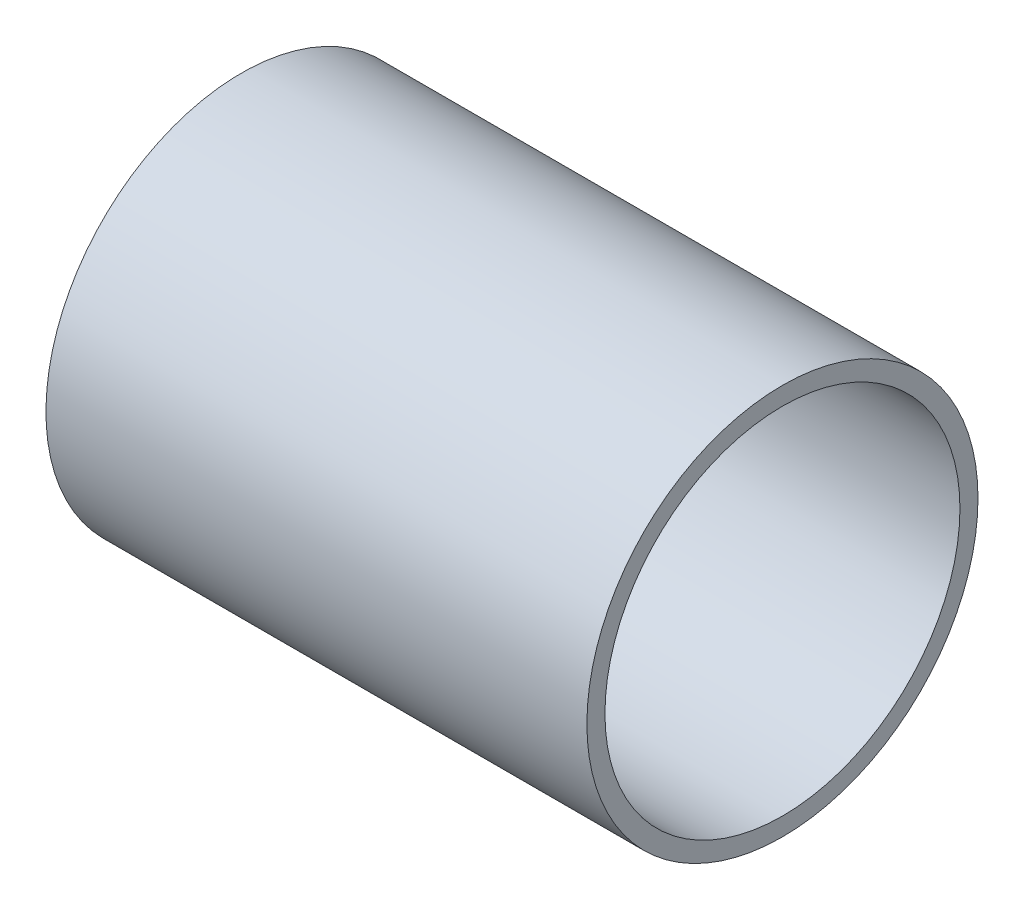
ISO-10303-21;
HEADER;
FILE_DESCRIPTION(('STEP AP214'),'2;1');
FILE_NAME('part.step','',(''),(''),'','','');
FILE_SCHEMA(('AUTOMOTIVE_DESIGN { 1 0 10303 214 1 1 1 1 }'));
ENDSEC;
DATA;
#1=APPLICATION_CONTEXT('core data for automotive mechanical design processes');
#2=APPLICATION_PROTOCOL_DEFINITION('international standard','automotive_design',2000,#1);
#3=PRODUCT_CONTEXT('',#1,'mechanical');
#4=PRODUCT('Part','Part','',(#3));
#5=PRODUCT_RELATED_PRODUCT_CATEGORY('part','',(#4));
#6=PRODUCT_DEFINITION_FORMATION('','',#4);
#7=PRODUCT_DEFINITION_CONTEXT('part definition',#1,'design');
#8=PRODUCT_DEFINITION('design','',#6,#7);
#9=PRODUCT_DEFINITION_SHAPE('','',#8);
#10=(LENGTH_UNIT() NAMED_UNIT(*) SI_UNIT(.MILLI.,.METRE.));
#11=(NAMED_UNIT(*) PLANE_ANGLE_UNIT() SI_UNIT($,.RADIAN.));
#12=(NAMED_UNIT(*) SI_UNIT($,.STERADIAN.) SOLID_ANGLE_UNIT());
#13=UNCERTAINTY_MEASURE_WITH_UNIT(LENGTH_MEASURE(1.E-05),#10,'distance_accuracy_value','');
#14=(GEOMETRIC_REPRESENTATION_CONTEXT(3) GLOBAL_UNCERTAINTY_ASSIGNED_CONTEXT((#13)) GLOBAL_UNIT_ASSIGNED_CONTEXT((#10,
#11,#12)) REPRESENTATION_CONTEXT('',''));
#15=CARTESIAN_POINT('',(0.,0.,0.));
#16=DIRECTION('',(0.,0.,1.));
#17=DIRECTION('',(1.,0.,0.));
#18=AXIS2_PLACEMENT_3D('',#15,#16,#17);
#19=CARTESIAN_POINT('',(136.623881554251,0.,0.));
#20=DIRECTION('',(-1.,0.,0.));
#21=DIRECTION('',(0.,0.,1.));
#22=AXIS2_PLACEMENT_3D('',#19,#20,#21);
#23=CYLINDRICAL_SURFACE('',#22,32.5);
#24=CARTESIAN_POINT('',(44.7,0.,0.));
#25=DIRECTION('',(1.,0.,0.));
#26=DIRECTION('',(0.,0.,-1.));
#27=AXIS2_PLACEMENT_3D('',#24,#25,#26);
#28=CIRCLE('',#27,32.5);
#29=CARTESIAN_POINT('',(44.6999999999999,0.,-32.5));
#30=VERTEX_POINT('',#29);
#31=EDGE_CURVE('E11',#30,#30,#28,.T.);
#32=ORIENTED_EDGE('',*,*,#31,.F.);
#33=EDGE_LOOP('',(#32));
#34=FACE_BOUND('',#33,.T.);
#35=CARTESIAN_POINT('',(-45.1999999999999,-4.96579309501303E-13,2.81759707922987E-13));
#36=DIRECTION('',(-1.,0.,0.));
#37=DIRECTION('',(0.,-0.804526656146507,0.593916542579613));
#38=AXIS2_PLACEMENT_3D('',#35,#36,#37);
#39=CIRCLE('',#38,32.5);
#40=CARTESIAN_POINT('',(-45.2,-26.147116324762,19.3022876338377));
#41=VERTEX_POINT('',#40);
#42=EDGE_CURVE('E61',#41,#41,#39,.T.);
#43=ORIENTED_EDGE('',*,*,#42,.F.);
#44=EDGE_LOOP('',(#43));
#45=FACE_BOUND('',#44,.T.);
#46=ADVANCED_FACE('F47',(#34,#45),#23,.T.);
#47=CARTESIAN_POINT('',(136.623881554251,0.,0.));
#48=DIRECTION('',(-1.,0.,0.));
#49=DIRECTION('',(0.,0.,1.));
#50=AXIS2_PLACEMENT_3D('',#47,#48,#49);
#51=CYLINDRICAL_SURFACE('',#50,29.5);
#52=CARTESIAN_POINT('',(44.7,0.,0.));
#53=DIRECTION('',(1.,0.,0.));
#54=DIRECTION('',(0.,0.,-1.));
#55=AXIS2_PLACEMENT_3D('',#52,#53,#54);
#56=CIRCLE('',#55,29.5);
#57=CARTESIAN_POINT('',(44.6999999999999,0.,-29.5));
#58=VERTEX_POINT('',#57);
#59=EDGE_CURVE('E50',#58,#58,#56,.T.);
#60=ORIENTED_EDGE('',*,*,#59,.T.);
#61=EDGE_LOOP('',(#60));
#62=FACE_BOUND('',#61,.T.);
#63=CARTESIAN_POINT('',(-45.1999999999999,0.,0.));
#64=DIRECTION('',(-1.,0.,0.));
#65=DIRECTION('',(0.,-1.,0.));
#66=AXIS2_PLACEMENT_3D('',#63,#64,#65);
#67=CIRCLE('',#66,29.5);
#68=CARTESIAN_POINT('',(-45.2,-29.5,0.));
#69=VERTEX_POINT('',#68);
#70=EDGE_CURVE('E57',#69,#69,#67,.F.);
#71=ORIENTED_EDGE('',*,*,#70,.F.);
#72=EDGE_LOOP('',(#71));
#73=FACE_BOUND('',#72,.T.);
#74=ADVANCED_FACE('F69',(#62,#73),#51,.F.);
#75=CARTESIAN_POINT('',(44.7,1.00000000000001,0.));
#76=DIRECTION('',(1.,0.,0.));
#77=DIRECTION('',(0.,0.996056097354405,-0.088725706100954));
#78=AXIS2_PLACEMENT_3D('',#75,#76,#77);
#79=PLANE('',#78);
#80=ORIENTED_EDGE('',*,*,#59,.F.);
#81=EDGE_LOOP('',(#80));
#82=FACE_BOUND('',#81,.T.);
#83=ORIENTED_EDGE('',*,*,#31,.T.);
#84=EDGE_LOOP('',(#83));
#85=FACE_BOUND('',#84,.T.);
#86=ADVANCED_FACE('F74',(#82,#85),#79,.T.);
#87=CARTESIAN_POINT('',(-45.1999999999999,-4.96579309501303E-13,2.81759707922987E-13));
#88=DIRECTION('',(-1.,0.,0.));
#89=DIRECTION('',(0.,-0.804526656146507,0.593916542579613));
#90=AXIS2_PLACEMENT_3D('',#87,#88,#89);
#91=PLANE('',#90);
#92=ORIENTED_EDGE('',*,*,#42,.T.);
#93=EDGE_LOOP('',(#92));
#94=FACE_BOUND('',#93,.T.);
#95=ORIENTED_EDGE('',*,*,#70,.T.);
#96=EDGE_LOOP('',(#95));
#97=FACE_BOUND('',#96,.T.);
#98=ADVANCED_FACE('F65',(#94,#97),#91,.T.);
#99=CLOSED_SHELL('',(#46,#74,#86,#98));
#100=MANIFOLD_SOLID_BREP('B2',#99);
#101=ADVANCED_BREP_SHAPE_REPRESENTATION('',(#18,#100),#14);
#102=SHAPE_DEFINITION_REPRESENTATION(#9,#101);
ENDSEC;
END-ISO-10303-21;
